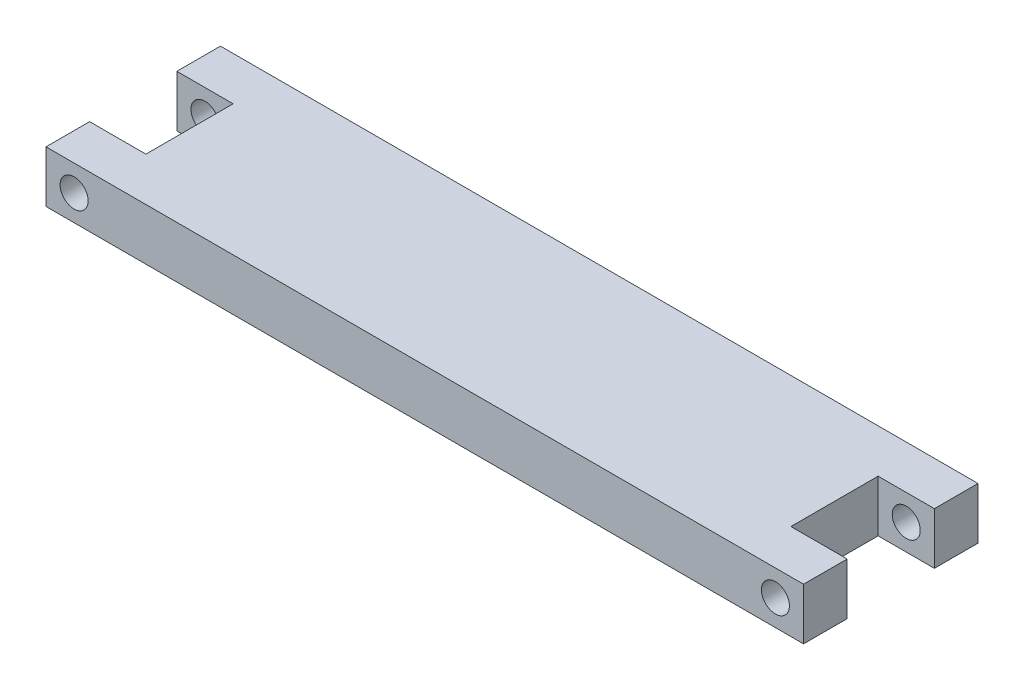
ISO-10303-21;
HEADER;
FILE_DESCRIPTION(('STEP AP214'),'2;1');
FILE_NAME('part.step','',(''),(''),'','','');
FILE_SCHEMA(('AUTOMOTIVE_DESIGN { 1 0 10303 214 1 1 1 1 }'));
ENDSEC;
DATA;
#1=APPLICATION_CONTEXT('core data for automotive mechanical design processes');
#2=APPLICATION_PROTOCOL_DEFINITION('international standard','automotive_design',2000,#1);
#3=PRODUCT_CONTEXT('',#1,'mechanical');
#4=PRODUCT('Part','Part','',(#3));
#5=PRODUCT_RELATED_PRODUCT_CATEGORY('part','',(#4));
#6=PRODUCT_DEFINITION_FORMATION('','',#4);
#7=PRODUCT_DEFINITION_CONTEXT('part definition',#1,'design');
#8=PRODUCT_DEFINITION('design','',#6,#7);
#9=PRODUCT_DEFINITION_SHAPE('','',#8);
#10=(LENGTH_UNIT() NAMED_UNIT(*) SI_UNIT(.MILLI.,.METRE.));
#11=(NAMED_UNIT(*) PLANE_ANGLE_UNIT() SI_UNIT($,.RADIAN.));
#12=(NAMED_UNIT(*) SI_UNIT($,.STERADIAN.) SOLID_ANGLE_UNIT());
#13=UNCERTAINTY_MEASURE_WITH_UNIT(LENGTH_MEASURE(1.E-05),#10,'distance_accuracy_value','');
#14=(GEOMETRIC_REPRESENTATION_CONTEXT(3) GLOBAL_UNCERTAINTY_ASSIGNED_CONTEXT((#13)) GLOBAL_UNIT_ASSIGNED_CONTEXT((#10,
#11,#12)) REPRESENTATION_CONTEXT('',''));
#15=CARTESIAN_POINT('',(0.,0.,0.));
#16=DIRECTION('',(0.,0.,1.));
#17=DIRECTION('',(1.,0.,0.));
#18=AXIS2_PLACEMENT_3D('',#15,#16,#17);
#19=CARTESIAN_POINT('',(0.,4.,-10.123575617553));
#20=DIRECTION('',(0.,0.,-1.));
#21=DIRECTION('',(-1.,0.,0.));
#22=AXIS2_PLACEMENT_3D('',#19,#20,#21);
#23=PLANE('',#22);
#24=DIRECTION('',(1.,0.,0.));
#25=VECTOR('',#24,1.);
#26=CARTESIAN_POINT('',(0.,0.,-10.123575617553));
#27=LINE('',#26,#25);
#28=CARTESIAN_POINT('',(54.2596732192591,0.,-10.123575617553));
#29=VERTEX_POINT('',#28);
#30=CARTESIAN_POINT('',(58.6133747466731,0.,-10.123575617553));
#31=VERTEX_POINT('',#30);
#32=EDGE_CURVE('E154',#29,#31,#27,.T.);
#33=ORIENTED_EDGE('',*,*,#32,.T.);
#34=DIRECTION('',(0.,-1.,0.));
#35=VECTOR('',#34,1.);
#36=CARTESIAN_POINT('',(58.6133747466731,4.,-10.123575617553));
#37=LINE('',#36,#35);
#38=CARTESIAN_POINT('',(58.6133747466731,4.,-10.123575617553));
#39=VERTEX_POINT('',#38);
#40=EDGE_CURVE('E42',#39,#31,#37,.T.);
#41=ORIENTED_EDGE('',*,*,#40,.F.);
#42=DIRECTION('',(1.,0.,0.));
#43=VECTOR('',#42,1.);
#44=CARTESIAN_POINT('',(0.,4.,-10.123575617553));
#45=LINE('',#44,#43);
#46=CARTESIAN_POINT('',(54.2596732192591,4.,-10.123575617553));
#47=VERTEX_POINT('',#46);
#48=EDGE_CURVE('E226',#47,#39,#45,.T.);
#49=ORIENTED_EDGE('',*,*,#48,.F.);
#50=DIRECTION('',(0.,-1.,0.));
#51=VECTOR('',#50,1.);
#52=CARTESIAN_POINT('',(54.2596732192591,4.,-10.123575617553));
#53=LINE('',#52,#51);
#54=EDGE_CURVE('E11',#47,#29,#53,.T.);
#55=ORIENTED_EDGE('',*,*,#54,.T.);
#56=EDGE_LOOP('',(#33,#41,#49,#55));
#57=FACE_BOUND('',#56,.T.);
#58=CARTESIAN_POINT('',(56.4365239829661,2.,-10.123575617553));
#59=DIRECTION('',(0.,0.,-1.));
#60=DIRECTION('',(-1.,0.,0.));
#61=AXIS2_PLACEMENT_3D('',#58,#59,#60);
#62=CIRCLE('',#61,1.08475397364903);
#63=CARTESIAN_POINT('',(55.351770009317,2.,-10.123575617553));
#64=VERTEX_POINT('',#63);
#65=EDGE_CURVE('E247',#64,#64,#62,.F.);
#66=ORIENTED_EDGE('',*,*,#65,.F.);
#67=EDGE_LOOP('',(#66));
#68=FACE_BOUND('',#67,.T.);
#69=ADVANCED_FACE('F32',(#57,#68),#23,.F.);
#70=CARTESIAN_POINT('',(0.,4.,-13.498100823404));
#71=DIRECTION('',(0.,0.,-1.));
#72=DIRECTION('',(-1.,0.,0.));
#73=AXIS2_PLACEMENT_3D('',#70,#71,#72);
#74=PLANE('',#73);
#75=DIRECTION('',(1.,0.,0.));
#76=VECTOR('',#75,1.);
#77=CARTESIAN_POINT('',(0.,0.,-13.498100823404));
#78=LINE('',#77,#76);
#79=CARTESIAN_POINT('',(0.,0.,-13.498100823404));
#80=VERTEX_POINT('',#79);
#81=CARTESIAN_POINT('',(58.6133747466731,0.,-13.498100823404));
#82=VERTEX_POINT('',#81);
#83=EDGE_CURVE('E160',#80,#82,#78,.T.);
#84=ORIENTED_EDGE('',*,*,#83,.F.);
#85=DIRECTION('',(0.,-1.,0.));
#86=VECTOR('',#85,1.);
#87=CARTESIAN_POINT('',(0.,4.,-13.498100823404));
#88=LINE('',#87,#86);
#89=CARTESIAN_POINT('',(0.,4.,-13.498100823404));
#90=VERTEX_POINT('',#89);
#91=EDGE_CURVE('E196',#90,#80,#88,.T.);
#92=ORIENTED_EDGE('',*,*,#91,.F.);
#93=DIRECTION('',(1.,0.,0.));
#94=VECTOR('',#93,1.);
#95=CARTESIAN_POINT('',(0.,4.,-13.498100823404));
#96=LINE('',#95,#94);
#97=CARTESIAN_POINT('',(58.6133747466731,4.,-13.498100823404));
#98=VERTEX_POINT('',#97);
#99=EDGE_CURVE('E219',#90,#98,#96,.T.);
#100=ORIENTED_EDGE('',*,*,#99,.T.);
#101=DIRECTION('',(0.,-1.,0.));
#102=VECTOR('',#101,1.);
#103=CARTESIAN_POINT('',(58.6133747466731,4.,-13.498100823404));
#104=LINE('',#103,#102);
#105=EDGE_CURVE('E198',#98,#82,#104,.T.);
#106=ORIENTED_EDGE('',*,*,#105,.T.);
#107=EDGE_LOOP('',(#84,#92,#100,#106));
#108=FACE_BOUND('',#107,.T.);
#109=CARTESIAN_POINT('',(2.17685076370699,2.,-13.498100823404));
#110=DIRECTION('',(0.,0.,1.));
#111=DIRECTION('',(1.,0.,0.));
#112=AXIS2_PLACEMENT_3D('',#109,#110,#111);
#113=CIRCLE('',#112,1.08475397364903);
#114=CARTESIAN_POINT('',(3.26160473735603,2.,-13.498100823404));
#115=VERTEX_POINT('',#114);
#116=EDGE_CURVE('E260',#115,#115,#113,.T.);
#117=ORIENTED_EDGE('',*,*,#116,.T.);
#118=EDGE_LOOP('',(#117));
#119=FACE_BOUND('',#118,.T.);
#120=CARTESIAN_POINT('',(56.4365239829661,2.,-13.498100823404));
#121=DIRECTION('',(0.,0.,-1.));
#122=DIRECTION('',(-1.,0.,0.));
#123=AXIS2_PLACEMENT_3D('',#120,#121,#122);
#124=CIRCLE('',#123,1.08475397364903);
#125=CARTESIAN_POINT('',(55.351770009317,2.,-13.498100823404));
#126=VERTEX_POINT('',#125);
#127=EDGE_CURVE('E253',#126,#126,#124,.T.);
#128=ORIENTED_EDGE('',*,*,#127,.F.);
#129=EDGE_LOOP('',(#128));
#130=FACE_BOUND('',#129,.T.);
#131=ADVANCED_FACE('F215',(#108,#119,#130),#74,.T.);
#132=CARTESIAN_POINT('',(0.,4.,0.));
#133=DIRECTION('',(0.,0.,-1.));
#134=DIRECTION('',(-1.,0.,0.));
#135=AXIS2_PLACEMENT_3D('',#132,#133,#134);
#136=PLANE('',#135);
#137=DIRECTION('',(1.,0.,0.));
#138=VECTOR('',#137,1.);
#139=CARTESIAN_POINT('',(0.,0.,0.));
#140=LINE('',#139,#138);
#141=CARTESIAN_POINT('',(0.,0.,0.));
#142=VERTEX_POINT('',#141);
#143=CARTESIAN_POINT('',(58.6133747466731,0.,0.));
#144=VERTEX_POINT('',#143);
#145=EDGE_CURVE('E141',#142,#144,#140,.T.);
#146=ORIENTED_EDGE('',*,*,#145,.T.);
#147=DIRECTION('',(0.,-1.,0.));
#148=VECTOR('',#147,1.);
#149=CARTESIAN_POINT('',(58.6133747466731,4.,0.));
#150=LINE('',#149,#148);
#151=CARTESIAN_POINT('',(58.6133747466731,4.,0.));
#152=VERTEX_POINT('',#151);
#153=EDGE_CURVE('E137',#152,#144,#150,.T.);
#154=ORIENTED_EDGE('',*,*,#153,.F.);
#155=DIRECTION('',(1.,0.,0.));
#156=VECTOR('',#155,1.);
#157=CARTESIAN_POINT('',(0.,4.,0.));
#158=LINE('',#157,#156);
#159=CARTESIAN_POINT('',(0.,4.,0.));
#160=VERTEX_POINT('',#159);
#161=EDGE_CURVE('E125',#160,#152,#158,.T.);
#162=ORIENTED_EDGE('',*,*,#161,.F.);
#163=DIRECTION('',(0.,-1.,0.));
#164=VECTOR('',#163,1.);
#165=CARTESIAN_POINT('',(0.,4.,0.));
#166=LINE('',#165,#164);
#167=EDGE_CURVE('E144',#160,#142,#166,.T.);
#168=ORIENTED_EDGE('',*,*,#167,.T.);
#169=EDGE_LOOP('',(#146,#154,#162,#168));
#170=FACE_BOUND('',#169,.T.);
#171=CARTESIAN_POINT('',(2.17685076370699,2.,0.));
#172=DIRECTION('',(0.,0.,1.));
#173=DIRECTION('',(1.,0.,0.));
#174=AXIS2_PLACEMENT_3D('',#171,#172,#173);
#175=CIRCLE('',#174,1.08475397364903);
#176=CARTESIAN_POINT('',(3.26160473735603,2.,0.));
#177=VERTEX_POINT('',#176);
#178=EDGE_CURVE('E250',#177,#177,#175,.T.);
#179=ORIENTED_EDGE('',*,*,#178,.F.);
#180=EDGE_LOOP('',(#179));
#181=FACE_BOUND('',#180,.T.);
#182=CARTESIAN_POINT('',(56.4365239829661,2.,0.));
#183=DIRECTION('',(0.,0.,-1.));
#184=DIRECTION('',(-1.,0.,0.));
#185=AXIS2_PLACEMENT_3D('',#182,#183,#184);
#186=CIRCLE('',#185,1.08475397364903);
#187=CARTESIAN_POINT('',(55.351770009317,2.,0.));
#188=VERTEX_POINT('',#187);
#189=EDGE_CURVE('E248',#188,#188,#186,.T.);
#190=ORIENTED_EDGE('',*,*,#189,.T.);
#191=EDGE_LOOP('',(#190));
#192=FACE_BOUND('',#191,.T.);
#193=ADVANCED_FACE('F138',(#170,#181,#192),#136,.F.);
#194=CARTESIAN_POINT('',(0.,4.,-3.3745252058509));
#195=DIRECTION('',(0.,0.,-1.));
#196=DIRECTION('',(-1.,0.,0.));
#197=AXIS2_PLACEMENT_3D('',#194,#195,#196);
#198=PLANE('',#197);
#199=DIRECTION('',(1.,0.,0.));
#200=VECTOR('',#199,1.);
#201=CARTESIAN_POINT('',(0.,0.,-3.3745252058509));
#202=LINE('',#201,#200);
#203=CARTESIAN_POINT('',(54.2596732192591,0.,-3.37452520585099));
#204=VERTEX_POINT('',#203);
#205=CARTESIAN_POINT('',(58.6133747466731,0.,-3.374525205851));
#206=VERTEX_POINT('',#205);
#207=EDGE_CURVE('E180',#204,#206,#202,.T.);
#208=ORIENTED_EDGE('',*,*,#207,.F.);
#209=DIRECTION('',(0.,-1.,0.));
#210=VECTOR('',#209,1.);
#211=CARTESIAN_POINT('',(54.2596732192591,4.,-3.37452520585099));
#212=LINE('',#211,#210);
#213=CARTESIAN_POINT('',(54.2596732192591,4.,-3.37452520585099));
#214=VERTEX_POINT('',#213);
#215=EDGE_CURVE('E50',#214,#204,#212,.T.);
#216=ORIENTED_EDGE('',*,*,#215,.F.);
#217=DIRECTION('',(1.,0.,0.));
#218=VECTOR('',#217,1.);
#219=CARTESIAN_POINT('',(0.,4.,-3.3745252058509));
#220=LINE('',#219,#218);
#221=CARTESIAN_POINT('',(58.6133747466731,4.,-3.374525205851));
#222=VERTEX_POINT('',#221);
#223=EDGE_CURVE('E147',#214,#222,#220,.T.);
#224=ORIENTED_EDGE('',*,*,#223,.T.);
#225=DIRECTION('',(0.,-1.,0.));
#226=VECTOR('',#225,1.);
#227=CARTESIAN_POINT('',(58.6133747466731,4.,-3.374525205851));
#228=LINE('',#227,#226);
#229=EDGE_CURVE('E88',#222,#206,#228,.T.);
#230=ORIENTED_EDGE('',*,*,#229,.T.);
#231=EDGE_LOOP('',(#208,#216,#224,#230));
#232=FACE_BOUND('',#231,.T.);
#233=CARTESIAN_POINT('',(56.4365239829661,2.,-3.374525205851));
#234=DIRECTION('',(0.,0.,-1.));
#235=DIRECTION('',(-1.,0.,0.));
#236=AXIS2_PLACEMENT_3D('',#233,#234,#235);
#237=CIRCLE('',#236,1.08475397364903);
#238=CARTESIAN_POINT('',(55.351770009317,2.,-3.37452520585099));
#239=VERTEX_POINT('',#238);
#240=EDGE_CURVE('E36',#239,#239,#237,.F.);
#241=ORIENTED_EDGE('',*,*,#240,.T.);
#242=EDGE_LOOP('',(#241));
#243=FACE_BOUND('',#242,.T.);
#244=ADVANCED_FACE('F240',(#232,#243),#198,.T.);
#245=CARTESIAN_POINT('',(54.2596732192591,4.,0.));
#246=DIRECTION('',(1.,0.,0.));
#247=DIRECTION('',(0.,0.,-1.));
#248=AXIS2_PLACEMENT_3D('',#245,#246,#247);
#249=PLANE('',#248);
#250=DIRECTION('',(0.,0.,1.));
#251=VECTOR('',#250,1.);
#252=CARTESIAN_POINT('',(54.2596732192591,0.,0.));
#253=LINE('',#252,#251);
#254=EDGE_CURVE('E152',#29,#204,#253,.T.);
#255=ORIENTED_EDGE('',*,*,#254,.F.);
#256=ORIENTED_EDGE('',*,*,#54,.F.);
#257=DIRECTION('',(0.,0.,1.));
#258=VECTOR('',#257,1.);
#259=CARTESIAN_POINT('',(54.2596732192591,4.,0.));
#260=LINE('',#259,#258);
#261=EDGE_CURVE('E183',#47,#214,#260,.T.);
#262=ORIENTED_EDGE('',*,*,#261,.T.);
#263=ORIENTED_EDGE('',*,*,#215,.T.);
#264=EDGE_LOOP('',(#255,#256,#262,#263));
#265=FACE_BOUND('',#264,.T.);
#266=ADVANCED_FACE('F34',(#265),#249,.T.);
#267=CARTESIAN_POINT('',(58.6133747466731,4.,0.));
#268=DIRECTION('',(-1.,0.,0.));
#269=DIRECTION('',(0.,0.,1.));
#270=AXIS2_PLACEMENT_3D('',#267,#268,#269);
#271=PLANE('',#270);
#272=DIRECTION('',(0.,0.,-1.));
#273=VECTOR('',#272,1.);
#274=CARTESIAN_POINT('',(58.6133747466731,0.,0.));
#275=LINE('',#274,#273);
#276=EDGE_CURVE('E157',#31,#82,#275,.T.);
#277=ORIENTED_EDGE('',*,*,#276,.T.);
#278=ORIENTED_EDGE('',*,*,#105,.F.);
#279=DIRECTION('',(0.,0.,-1.));
#280=VECTOR('',#279,1.);
#281=CARTESIAN_POINT('',(58.6133747466731,4.,0.));
#282=LINE('',#281,#280);
#283=EDGE_CURVE('E207',#39,#98,#282,.T.);
#284=ORIENTED_EDGE('',*,*,#283,.F.);
#285=ORIENTED_EDGE('',*,*,#40,.T.);
#286=EDGE_LOOP('',(#277,#278,#284,#285));
#287=FACE_BOUND('',#286,.T.);
#288=ADVANCED_FACE('F205',(#287),#271,.F.);
#289=CARTESIAN_POINT('',(0.,4.,0.));
#290=DIRECTION('',(-1.,0.,0.));
#291=DIRECTION('',(0.,0.,1.));
#292=AXIS2_PLACEMENT_3D('',#289,#290,#291);
#293=PLANE('',#292);
#294=DIRECTION('',(0.,0.,-1.));
#295=VECTOR('',#294,1.);
#296=CARTESIAN_POINT('',(0.,0.,0.));
#297=LINE('',#296,#295);
#298=CARTESIAN_POINT('',(0.,0.,-10.123575617553));
#299=VERTEX_POINT('',#298);
#300=EDGE_CURVE('E163',#299,#80,#297,.T.);
#301=ORIENTED_EDGE('',*,*,#300,.F.);
#302=DIRECTION('',(0.,-1.,0.));
#303=VECTOR('',#302,1.);
#304=CARTESIAN_POINT('',(0.,4.,-10.123575617553));
#305=LINE('',#304,#303);
#306=CARTESIAN_POINT('',(0.,4.,-10.123575617553));
#307=VERTEX_POINT('',#306);
#308=EDGE_CURVE('E194',#307,#299,#305,.T.);
#309=ORIENTED_EDGE('',*,*,#308,.F.);
#310=DIRECTION('',(0.,0.,-1.));
#311=VECTOR('',#310,1.);
#312=CARTESIAN_POINT('',(0.,4.,0.));
#313=LINE('',#312,#311);
#314=EDGE_CURVE('E222',#307,#90,#313,.T.);
#315=ORIENTED_EDGE('',*,*,#314,.T.);
#316=ORIENTED_EDGE('',*,*,#91,.T.);
#317=EDGE_LOOP('',(#301,#309,#315,#316));
#318=FACE_BOUND('',#317,.T.);
#319=ADVANCED_FACE('F309',(#318),#293,.T.);
#320=CARTESIAN_POINT('',(0.,4.,-10.123575617553));
#321=DIRECTION('',(0.,0.,1.));
#322=DIRECTION('',(1.,0.,0.));
#323=AXIS2_PLACEMENT_3D('',#320,#321,#322);
#324=PLANE('',#323);
#325=CARTESIAN_POINT('',(2.17685076370699,2.,-10.123575617553));
#326=DIRECTION('',(0.,0.,1.));
#327=DIRECTION('',(1.,0.,0.));
#328=AXIS2_PLACEMENT_3D('',#325,#326,#327);
#329=CIRCLE('',#328,1.08475397364903);
#330=CARTESIAN_POINT('',(3.26160473735603,2.,-10.123575617553));
#331=VERTEX_POINT('',#330);
#332=EDGE_CURVE('E155',#331,#331,#329,.T.);
#333=ORIENTED_EDGE('',*,*,#332,.F.);
#334=EDGE_LOOP('',(#333));
#335=FACE_BOUND('',#334,.T.);
#336=DIRECTION('',(-1.,0.,0.));
#337=VECTOR('',#336,1.);
#338=CARTESIAN_POINT('',(0.,0.,-10.123575617553));
#339=LINE('',#338,#337);
#340=CARTESIAN_POINT('',(4.35370152741399,0.,-10.123575617553));
#341=VERTEX_POINT('',#340);
#342=EDGE_CURVE('E166',#341,#299,#339,.T.);
#343=ORIENTED_EDGE('',*,*,#342,.F.);
#344=DIRECTION('',(0.,-1.,0.));
#345=VECTOR('',#344,1.);
#346=CARTESIAN_POINT('',(4.35370152741399,4.,-10.123575617553));
#347=LINE('',#346,#345);
#348=CARTESIAN_POINT('',(4.35370152741399,4.,-10.123575617553));
#349=VERTEX_POINT('',#348);
#350=EDGE_CURVE('E192',#349,#341,#347,.T.);
#351=ORIENTED_EDGE('',*,*,#350,.F.);
#352=DIRECTION('',(-1.,0.,0.));
#353=VECTOR('',#352,1.);
#354=CARTESIAN_POINT('',(0.,4.,-10.123575617553));
#355=LINE('',#354,#353);
#356=EDGE_CURVE('E224',#349,#307,#355,.T.);
#357=ORIENTED_EDGE('',*,*,#356,.T.);
#358=ORIENTED_EDGE('',*,*,#308,.T.);
#359=EDGE_LOOP('',(#343,#351,#357,#358));
#360=FACE_BOUND('',#359,.T.);
#361=ADVANCED_FACE('F305',(#335,#360),#324,.T.);
#362=CARTESIAN_POINT('',(4.35370152741399,4.,0.));
#363=DIRECTION('',(1.,0.,0.));
#364=DIRECTION('',(0.,0.,-1.));
#365=AXIS2_PLACEMENT_3D('',#362,#363,#364);
#366=PLANE('',#365);
#367=DIRECTION('',(0.,0.,1.));
#368=VECTOR('',#367,1.);
#369=CARTESIAN_POINT('',(4.35370152741399,0.,0.));
#370=LINE('',#369,#368);
#371=CARTESIAN_POINT('',(4.35370152741399,0.,-3.37452520585099));
#372=VERTEX_POINT('',#371);
#373=EDGE_CURVE('E169',#341,#372,#370,.T.);
#374=ORIENTED_EDGE('',*,*,#373,.T.);
#375=DIRECTION('',(0.,-1.,0.));
#376=VECTOR('',#375,1.);
#377=CARTESIAN_POINT('',(4.35370152741399,4.,-3.37452520585099));
#378=LINE('',#377,#376);
#379=CARTESIAN_POINT('',(4.35370152741399,4.,-3.37452520585099));
#380=VERTEX_POINT('',#379);
#381=EDGE_CURVE('E189',#380,#372,#378,.T.);
#382=ORIENTED_EDGE('',*,*,#381,.F.);
#383=DIRECTION('',(0.,0.,1.));
#384=VECTOR('',#383,1.);
#385=CARTESIAN_POINT('',(4.35370152741399,4.,0.));
#386=LINE('',#385,#384);
#387=EDGE_CURVE('E232',#349,#380,#386,.T.);
#388=ORIENTED_EDGE('',*,*,#387,.F.);
#389=ORIENTED_EDGE('',*,*,#350,.T.);
#390=EDGE_LOOP('',(#374,#382,#388,#389));
#391=FACE_BOUND('',#390,.T.);
#392=ADVANCED_FACE('F301',(#391),#366,.F.);
#393=CARTESIAN_POINT('',(0.,4.,-3.37452520585099));
#394=DIRECTION('',(0.,0.,1.));
#395=DIRECTION('',(1.,0.,0.));
#396=AXIS2_PLACEMENT_3D('',#393,#394,#395);
#397=PLANE('',#396);
#398=CARTESIAN_POINT('',(2.17685076370699,2.,-3.37452520585099));
#399=DIRECTION('',(0.,0.,1.));
#400=DIRECTION('',(1.,0.,0.));
#401=AXIS2_PLACEMENT_3D('',#398,#399,#400);
#402=CIRCLE('',#401,1.08475397364903);
#403=CARTESIAN_POINT('',(3.26160473735603,2.,-3.37452520585099));
#404=VERTEX_POINT('',#403);
#405=EDGE_CURVE('E263',#404,#404,#402,.T.);
#406=ORIENTED_EDGE('',*,*,#405,.T.);
#407=EDGE_LOOP('',(#406));
#408=FACE_BOUND('',#407,.T.);
#409=DIRECTION('',(-1.,0.,0.));
#410=VECTOR('',#409,1.);
#411=CARTESIAN_POINT('',(0.,0.,-3.37452520585099));
#412=LINE('',#411,#410);
#413=CARTESIAN_POINT('',(0.,0.,-3.37452520585099));
#414=VERTEX_POINT('',#413);
#415=EDGE_CURVE('E171',#372,#414,#412,.T.);
#416=ORIENTED_EDGE('',*,*,#415,.T.);
#417=DIRECTION('',(0.,-1.,0.));
#418=VECTOR('',#417,1.);
#419=CARTESIAN_POINT('',(0.,4.,-3.37452520585099));
#420=LINE('',#419,#418);
#421=CARTESIAN_POINT('',(0.,4.,-3.37452520585099));
#422=VERTEX_POINT('',#421);
#423=EDGE_CURVE('E187',#422,#414,#420,.T.);
#424=ORIENTED_EDGE('',*,*,#423,.F.);
#425=DIRECTION('',(-1.,0.,0.));
#426=VECTOR('',#425,1.);
#427=CARTESIAN_POINT('',(0.,4.,-3.37452520585099));
#428=LINE('',#427,#426);
#429=EDGE_CURVE('E234',#380,#422,#428,.T.);
#430=ORIENTED_EDGE('',*,*,#429,.F.);
#431=ORIENTED_EDGE('',*,*,#381,.T.);
#432=EDGE_LOOP('',(#416,#424,#430,#431));
#433=FACE_BOUND('',#432,.T.);
#434=ADVANCED_FACE('F298',(#408,#433),#397,.F.);
#435=CARTESIAN_POINT('',(0.,4.,0.));
#436=DIRECTION('',(-1.,0.,0.));
#437=DIRECTION('',(0.,0.,1.));
#438=AXIS2_PLACEMENT_3D('',#435,#436,#437);
#439=PLANE('',#438);
#440=DIRECTION('',(0.,0.,-1.));
#441=VECTOR('',#440,1.);
#442=CARTESIAN_POINT('',(0.,0.,0.));
#443=LINE('',#442,#441);
#444=EDGE_CURVE('E174',#142,#414,#443,.T.);
#445=ORIENTED_EDGE('',*,*,#444,.F.);
#446=ORIENTED_EDGE('',*,*,#167,.F.);
#447=DIRECTION('',(0.,0.,-1.));
#448=VECTOR('',#447,1.);
#449=CARTESIAN_POINT('',(0.,4.,0.));
#450=LINE('',#449,#448);
#451=EDGE_CURVE('E133',#160,#422,#450,.T.);
#452=ORIENTED_EDGE('',*,*,#451,.T.);
#453=ORIENTED_EDGE('',*,*,#423,.T.);
#454=EDGE_LOOP('',(#445,#446,#452,#453));
#455=FACE_BOUND('',#454,.T.);
#456=ADVANCED_FACE('F237',(#455),#439,.T.);
#457=CARTESIAN_POINT('',(58.6133747466731,4.,0.));
#458=DIRECTION('',(-1.,0.,0.));
#459=DIRECTION('',(0.,0.,1.));
#460=AXIS2_PLACEMENT_3D('',#457,#458,#459);
#461=PLANE('',#460);
#462=DIRECTION('',(0.,0.,-1.));
#463=VECTOR('',#462,1.);
#464=CARTESIAN_POINT('',(58.6133747466731,0.,0.));
#465=LINE('',#464,#463);
#466=EDGE_CURVE('E178',#144,#206,#465,.T.);
#467=ORIENTED_EDGE('',*,*,#466,.T.);
#468=ORIENTED_EDGE('',*,*,#229,.F.);
#469=DIRECTION('',(0.,0.,-1.));
#470=VECTOR('',#469,1.);
#471=CARTESIAN_POINT('',(58.6133747466731,4.,0.));
#472=LINE('',#471,#470);
#473=EDGE_CURVE('E131',#152,#222,#472,.T.);
#474=ORIENTED_EDGE('',*,*,#473,.F.);
#475=ORIENTED_EDGE('',*,*,#153,.T.);
#476=EDGE_LOOP('',(#467,#468,#474,#475));
#477=FACE_BOUND('',#476,.T.);
#478=ADVANCED_FACE('F146',(#477),#461,.F.);
#479=CARTESIAN_POINT('',(0.,4.,0.));
#480=DIRECTION('',(0.,1.,0.));
#481=DIRECTION('',(0.,0.,1.));
#482=AXIS2_PLACEMENT_3D('',#479,#480,#481);
#483=PLANE('',#482);
#484=ORIENTED_EDGE('',*,*,#261,.F.);
#485=ORIENTED_EDGE('',*,*,#48,.T.);
#486=ORIENTED_EDGE('',*,*,#283,.T.);
#487=ORIENTED_EDGE('',*,*,#99,.F.);
#488=ORIENTED_EDGE('',*,*,#314,.F.);
#489=ORIENTED_EDGE('',*,*,#356,.F.);
#490=ORIENTED_EDGE('',*,*,#387,.T.);
#491=ORIENTED_EDGE('',*,*,#429,.T.);
#492=ORIENTED_EDGE('',*,*,#451,.F.);
#493=ORIENTED_EDGE('',*,*,#161,.T.);
#494=ORIENTED_EDGE('',*,*,#473,.T.);
#495=ORIENTED_EDGE('',*,*,#223,.F.);
#496=EDGE_LOOP('',(#484,#485,#486,#487,#488,#489,#490,#491,#492,#493,#494,#495));
#497=FACE_BOUND('',#496,.T.);
#498=ADVANCED_FACE('F128',(#497),#483,.T.);
#499=CARTESIAN_POINT('',(0.,0.,0.));
#500=DIRECTION('',(0.,1.,0.));
#501=DIRECTION('',(0.,0.,1.));
#502=AXIS2_PLACEMENT_3D('',#499,#500,#501);
#503=PLANE('',#502);
#504=ORIENTED_EDGE('',*,*,#254,.T.);
#505=ORIENTED_EDGE('',*,*,#207,.T.);
#506=ORIENTED_EDGE('',*,*,#466,.F.);
#507=ORIENTED_EDGE('',*,*,#145,.F.);
#508=ORIENTED_EDGE('',*,*,#444,.T.);
#509=ORIENTED_EDGE('',*,*,#415,.F.);
#510=ORIENTED_EDGE('',*,*,#373,.F.);
#511=ORIENTED_EDGE('',*,*,#342,.T.);
#512=ORIENTED_EDGE('',*,*,#300,.T.);
#513=ORIENTED_EDGE('',*,*,#83,.T.);
#514=ORIENTED_EDGE('',*,*,#276,.F.);
#515=ORIENTED_EDGE('',*,*,#32,.F.);
#516=EDGE_LOOP('',(#504,#505,#506,#507,#508,#509,#510,#511,#512,#513,#514,#515));
#517=FACE_BOUND('',#516,.T.);
#518=ADVANCED_FACE('F211',(#517),#503,.F.);
#519=CARTESIAN_POINT('',(2.17685076370699,2.,-13.498100823404));
#520=DIRECTION('',(0.,0.,1.));
#521=DIRECTION('',(1.,0.,0.));
#522=AXIS2_PLACEMENT_3D('',#519,#520,#521);
#523=CYLINDRICAL_SURFACE('',#522,1.08475397364903);
#524=ORIENTED_EDGE('',*,*,#178,.T.);
#525=EDGE_LOOP('',(#524));
#526=FACE_BOUND('',#525,.T.);
#527=ORIENTED_EDGE('',*,*,#405,.F.);
#528=EDGE_LOOP('',(#527));
#529=FACE_BOUND('',#528,.T.);
#530=ADVANCED_FACE('F286',(#526,#529),#523,.F.);
#531=ORIENTED_EDGE('',*,*,#332,.T.);
#532=EDGE_LOOP('',(#531));
#533=FACE_BOUND('',#532,.T.);
#534=ORIENTED_EDGE('',*,*,#116,.F.);
#535=EDGE_LOOP('',(#534));
#536=FACE_BOUND('',#535,.T.);
#537=ADVANCED_FACE('F282',(#533,#536),#523,.F.);
#538=CARTESIAN_POINT('',(56.4365239829661,2.,-13.498100823404));
#539=DIRECTION('',(0.,0.,1.));
#540=DIRECTION('',(1.,0.,0.));
#541=AXIS2_PLACEMENT_3D('',#538,#539,#540);
#542=CYLINDRICAL_SURFACE('',#541,1.08475397364903);
#543=ORIENTED_EDGE('',*,*,#240,.F.);
#544=EDGE_LOOP('',(#543));
#545=FACE_BOUND('',#544,.T.);
#546=ORIENTED_EDGE('',*,*,#189,.F.);
#547=EDGE_LOOP('',(#546));
#548=FACE_BOUND('',#547,.T.);
#549=ADVANCED_FACE('F276',(#545,#548),#542,.F.);
#550=ORIENTED_EDGE('',*,*,#127,.T.);
#551=EDGE_LOOP('',(#550));
#552=FACE_BOUND('',#551,.T.);
#553=ORIENTED_EDGE('',*,*,#65,.T.);
#554=EDGE_LOOP('',(#553));
#555=FACE_BOUND('',#554,.T.);
#556=ADVANCED_FACE('F274',(#552,#555),#542,.F.);
#557=CLOSED_SHELL('',(#69,#131,#193,#244,#266,#288,#319,#361,#392,#434,#456,#478,#498,#518,#530,
#537,#549,#556));
#558=MANIFOLD_SOLID_BREP('B2',#557);
#559=ADVANCED_BREP_SHAPE_REPRESENTATION('',(#18,#558),#14);
#560=SHAPE_DEFINITION_REPRESENTATION(#9,#559);
ENDSEC;
END-ISO-10303-21;
